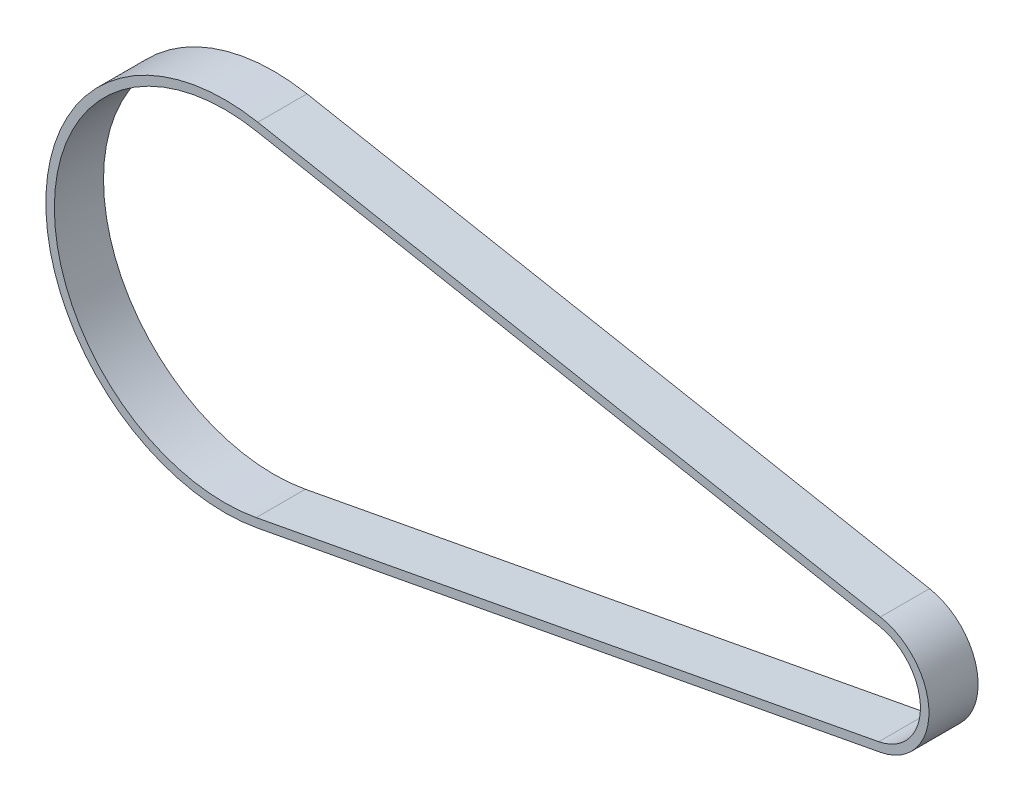
ISO-10303-21;
HEADER;
FILE_DESCRIPTION(('STEP AP214'),'2;1');
FILE_NAME('part.step','',(''),(''),'','','');
FILE_SCHEMA(('AUTOMOTIVE_DESIGN { 1 0 10303 214 1 1 1 1 }'));
ENDSEC;
DATA;
#1=APPLICATION_CONTEXT('core data for automotive mechanical design processes');
#2=APPLICATION_PROTOCOL_DEFINITION('international standard','automotive_design',2000,#1);
#3=PRODUCT_CONTEXT('',#1,'mechanical');
#4=PRODUCT('Part','Part','',(#3));
#5=PRODUCT_RELATED_PRODUCT_CATEGORY('part','',(#4));
#6=PRODUCT_DEFINITION_FORMATION('','',#4);
#7=PRODUCT_DEFINITION_CONTEXT('part definition',#1,'design');
#8=PRODUCT_DEFINITION('design','',#6,#7);
#9=PRODUCT_DEFINITION_SHAPE('','',#8);
#10=(LENGTH_UNIT() NAMED_UNIT(*) SI_UNIT(.MILLI.,.METRE.));
#11=(NAMED_UNIT(*) PLANE_ANGLE_UNIT() SI_UNIT($,.RADIAN.));
#12=(NAMED_UNIT(*) SI_UNIT($,.STERADIAN.) SOLID_ANGLE_UNIT());
#13=UNCERTAINTY_MEASURE_WITH_UNIT(LENGTH_MEASURE(1.E-05),#10,'distance_accuracy_value','');
#14=(GEOMETRIC_REPRESENTATION_CONTEXT(3) GLOBAL_UNCERTAINTY_ASSIGNED_CONTEXT((#13)) GLOBAL_UNIT_ASSIGNED_CONTEXT((#10,
#11,#12)) REPRESENTATION_CONTEXT('',''));
#15=CARTESIAN_POINT('',(0.,0.,0.));
#16=DIRECTION('',(0.,0.,1.));
#17=DIRECTION('',(1.,0.,0.));
#18=AXIS2_PLACEMENT_3D('',#15,#16,#17);
#19=CARTESIAN_POINT('',(0.,0.,6.4));
#20=DIRECTION('',(0.,0.,-1.));
#21=DIRECTION('',(-1.,0.,0.));
#22=AXIS2_PLACEMENT_3D('',#19,#20,#21);
#23=CYLINDRICAL_SURFACE('',#22,23.285);
#24=CARTESIAN_POINT('',(0.,0.,0.));
#25=DIRECTION('',(0.,0.,1.));
#26=DIRECTION('',(1.,0.,0.));
#27=AXIS2_PLACEMENT_3D('',#24,#25,#26);
#28=CIRCLE('',#27,23.285);
#29=CARTESIAN_POINT('',(4.3081828745084,22.8829802543242,0.));
#30=VERTEX_POINT('',#29);
#31=CARTESIAN_POINT('',(4.3081828745084,-22.8829802543242,0.));
#32=VERTEX_POINT('',#31);
#33=EDGE_CURVE('E151',#30,#32,#28,.T.);
#34=ORIENTED_EDGE('',*,*,#33,.T.);
#35=DIRECTION('',(0.,0.,-1.));
#36=VECTOR('',#35,1.);
#37=CARTESIAN_POINT('',(4.3081828745084,-22.8829802543242,6.4));
#38=LINE('',#37,#36);
#39=CARTESIAN_POINT('',(4.3081828745084,-22.8829802543242,6.4));
#40=VERTEX_POINT('',#39);
#41=EDGE_CURVE('E11',#40,#32,#38,.T.);
#42=ORIENTED_EDGE('',*,*,#41,.F.);
#43=CARTESIAN_POINT('',(0.,0.,6.4));
#44=DIRECTION('',(0.,0.,1.));
#45=DIRECTION('',(1.,0.,0.));
#46=AXIS2_PLACEMENT_3D('',#43,#44,#45);
#47=CIRCLE('',#46,23.285);
#48=CARTESIAN_POINT('',(4.3081828745084,22.8829802543242,6.4));
#49=VERTEX_POINT('',#48);
#50=EDGE_CURVE('E157',#49,#40,#47,.T.);
#51=ORIENTED_EDGE('',*,*,#50,.F.);
#52=DIRECTION('',(0.,0.,-1.));
#53=VECTOR('',#52,1.);
#54=CARTESIAN_POINT('',(4.3081828745084,22.8829802543242,6.4));
#55=LINE('',#54,#53);
#56=EDGE_CURVE('E171',#49,#30,#55,.T.);
#57=ORIENTED_EDGE('',*,*,#56,.T.);
#58=EDGE_LOOP('',(#34,#42,#51,#57));
#59=FACE_BOUND('',#58,.T.);
#60=ADVANCED_FACE('F43',(#59),#23,.T.);
#61=CARTESIAN_POINT('',(4.3081828745084,-22.8829802543242,6.4));
#62=DIRECTION('',(-0.185019663925635,0.982734818738425,0.));
#63=DIRECTION('',(-0.982734818738425,-0.185019663925635,0.));
#64=AXIS2_PLACEMENT_3D('',#61,#62,#63);
#65=PLANE('',#64);
#66=DIRECTION('',(0.982734818738425,0.185019663925635,0.));
#67=VECTOR('',#66,1.);
#68=CARTESIAN_POINT('',(4.3081828745084,-22.8829802543242,0.));
#69=LINE('',#68,#67);
#70=CARTESIAN_POINT('',(85.3457525920629,-7.62602219341018,0.));
#71=VERTEX_POINT('',#70);
#72=EDGE_CURVE('E175',#32,#71,#69,.T.);
#73=ORIENTED_EDGE('',*,*,#72,.T.);
#74=DIRECTION('',(0.,0.,-1.));
#75=VECTOR('',#74,1.);
#76=CARTESIAN_POINT('',(85.3457525920629,-7.62602219341018,6.4));
#77=LINE('',#76,#75);
#78=CARTESIAN_POINT('',(85.3457525920629,-7.62602219341018,6.4));
#79=VERTEX_POINT('',#78);
#80=EDGE_CURVE('E51',#79,#71,#77,.T.);
#81=ORIENTED_EDGE('',*,*,#80,.F.);
#82=DIRECTION('',(0.982734818738425,0.185019663925635,0.));
#83=VECTOR('',#82,1.);
#84=CARTESIAN_POINT('',(4.3081828745084,-22.8829802543242,6.4));
#85=LINE('',#84,#83);
#86=EDGE_CURVE('E161',#40,#79,#85,.T.);
#87=ORIENTED_EDGE('',*,*,#86,.F.);
#88=ORIENTED_EDGE('',*,*,#41,.T.);
#89=EDGE_LOOP('',(#73,#81,#87,#88));
#90=FACE_BOUND('',#89,.T.);
#91=ADVANCED_FACE('F209',(#90),#65,.F.);
#92=CARTESIAN_POINT('',(83.91,0.,6.4));
#93=DIRECTION('',(0.,0.,-1.));
#94=DIRECTION('',(-1.,0.,0.));
#95=AXIS2_PLACEMENT_3D('',#92,#93,#94);
#96=CYLINDRICAL_SURFACE('',#95,7.76);
#97=CARTESIAN_POINT('',(83.91,0.,0.));
#98=DIRECTION('',(0.,0.,1.));
#99=DIRECTION('',(1.,0.,0.));
#100=AXIS2_PLACEMENT_3D('',#97,#98,#99);
#101=CIRCLE('',#100,7.76);
#102=CARTESIAN_POINT('',(85.3457525920629,7.62602219341018,0.));
#103=VERTEX_POINT('',#102);
#104=EDGE_CURVE('E178',#71,#103,#101,.T.);
#105=ORIENTED_EDGE('',*,*,#104,.T.);
#106=DIRECTION('',(0.,0.,-1.));
#107=VECTOR('',#106,1.);
#108=CARTESIAN_POINT('',(85.3457525920629,7.62602219341018,6.4));
#109=LINE('',#108,#107);
#110=CARTESIAN_POINT('',(85.3457525920629,7.62602219341018,6.4));
#111=VERTEX_POINT('',#110);
#112=EDGE_CURVE('E186',#111,#103,#109,.T.);
#113=ORIENTED_EDGE('',*,*,#112,.F.);
#114=CARTESIAN_POINT('',(83.91,0.,6.4));
#115=DIRECTION('',(0.,0.,1.));
#116=DIRECTION('',(1.,0.,0.));
#117=AXIS2_PLACEMENT_3D('',#114,#115,#116);
#118=CIRCLE('',#117,7.76);
#119=EDGE_CURVE('E165',#79,#111,#118,.T.);
#120=ORIENTED_EDGE('',*,*,#119,.F.);
#121=ORIENTED_EDGE('',*,*,#80,.T.);
#122=EDGE_LOOP('',(#105,#113,#120,#121));
#123=FACE_BOUND('',#122,.T.);
#124=ADVANCED_FACE('F195',(#123),#96,.T.);
#125=CARTESIAN_POINT('',(4.3081828745084,22.8829802543242,6.4));
#126=DIRECTION('',(-0.185019663925635,-0.982734818738425,0.));
#127=DIRECTION('',(0.982734818738425,-0.185019663925635,0.));
#128=AXIS2_PLACEMENT_3D('',#125,#126,#127);
#129=PLANE('',#128);
#130=DIRECTION('',(-0.982734818738425,0.185019663925635,0.));
#131=VECTOR('',#130,1.);
#132=CARTESIAN_POINT('',(4.3081828745084,22.8829802543242,0.));
#133=LINE('',#132,#131);
#134=EDGE_CURVE('E162',#103,#30,#133,.T.);
#135=ORIENTED_EDGE('',*,*,#134,.T.);
#136=ORIENTED_EDGE('',*,*,#56,.F.);
#137=DIRECTION('',(-0.982734818738425,0.185019663925635,0.));
#138=VECTOR('',#137,1.);
#139=CARTESIAN_POINT('',(4.3081828745084,22.8829802543242,6.4));
#140=LINE('',#139,#138);
#141=EDGE_CURVE('E168',#111,#49,#140,.T.);
#142=ORIENTED_EDGE('',*,*,#141,.F.);
#143=ORIENTED_EDGE('',*,*,#112,.T.);
#144=EDGE_LOOP('',(#135,#136,#142,#143));
#145=FACE_BOUND('',#144,.T.);
#146=ADVANCED_FACE('F202',(#145),#129,.F.);
#147=CARTESIAN_POINT('',(0.,0.,6.4));
#148=DIRECTION('',(0.,0.,1.));
#149=DIRECTION('',(1.,0.,0.));
#150=AXIS2_PLACEMENT_3D('',#147,#148,#149);
#151=PLANE('',#150);
#152=CARTESIAN_POINT('',(83.91,0.,6.4));
#153=DIRECTION('',(0.,0.,1.));
#154=DIRECTION('',(1.,0.,0.));
#155=AXIS2_PLACEMENT_3D('',#152,#153,#154);
#156=CIRCLE('',#155,6.65);
#157=CARTESIAN_POINT('',(85.1403807651055,-6.53518654461053,6.4));
#158=VERTEX_POINT('',#157);
#159=CARTESIAN_POINT('',(85.1403807651054,6.53518654461054,6.4));
#160=VERTEX_POINT('',#159);
#161=EDGE_CURVE('E58',#158,#160,#156,.T.);
#162=ORIENTED_EDGE('',*,*,#161,.F.);
#163=DIRECTION('',(0.982734818738425,0.185019663925635,0.));
#164=VECTOR('',#163,1.);
#165=CARTESIAN_POINT('',(4.10281104755095,-21.7921446055246,6.4));
#166=LINE('',#165,#164);
#167=CARTESIAN_POINT('',(4.10281104755094,-21.7921446055246,6.4));
#168=VERTEX_POINT('',#167);
#169=EDGE_CURVE('E129',#168,#158,#166,.T.);
#170=ORIENTED_EDGE('',*,*,#169,.F.);
#171=CARTESIAN_POINT('',(0.,0.,6.4));
#172=DIRECTION('',(0.,0.,1.));
#173=DIRECTION('',(1.,0.,0.));
#174=AXIS2_PLACEMENT_3D('',#171,#172,#173);
#175=CIRCLE('',#174,22.175);
#176=CARTESIAN_POINT('',(4.10281104755095,21.7921446055246,6.4));
#177=VERTEX_POINT('',#176);
#178=EDGE_CURVE('E133',#177,#168,#175,.T.);
#179=ORIENTED_EDGE('',*,*,#178,.F.);
#180=DIRECTION('',(-0.982734818738425,0.185019663925635,0.));
#181=VECTOR('',#180,1.);
#182=CARTESIAN_POINT('',(4.10281104755095,21.7921446055246,6.4));
#183=LINE('',#182,#181);
#184=EDGE_CURVE('E142',#160,#177,#183,.T.);
#185=ORIENTED_EDGE('',*,*,#184,.F.);
#186=EDGE_LOOP('',(#162,#170,#179,#185));
#187=FACE_BOUND('',#186,.T.);
#188=ORIENTED_EDGE('',*,*,#50,.T.);
#189=ORIENTED_EDGE('',*,*,#86,.T.);
#190=ORIENTED_EDGE('',*,*,#119,.T.);
#191=ORIENTED_EDGE('',*,*,#141,.T.);
#192=EDGE_LOOP('',(#188,#189,#190,#191));
#193=FACE_BOUND('',#192,.T.);
#194=ADVANCED_FACE('F208',(#187,#193),#151,.T.);
#195=CARTESIAN_POINT('',(0.,0.,0.));
#196=DIRECTION('',(0.,0.,1.));
#197=DIRECTION('',(1.,0.,0.));
#198=AXIS2_PLACEMENT_3D('',#195,#196,#197);
#199=PLANE('',#198);
#200=DIRECTION('',(0.982734818738425,0.185019663925635,0.));
#201=VECTOR('',#200,1.);
#202=CARTESIAN_POINT('',(4.10281104755095,-21.7921446055246,0.));
#203=LINE('',#202,#201);
#204=CARTESIAN_POINT('',(4.10281104755094,-21.7921446055246,0.));
#205=VERTEX_POINT('',#204);
#206=CARTESIAN_POINT('',(85.1403807651055,-6.53518654461053,0.));
#207=VERTEX_POINT('',#206);
#208=EDGE_CURVE('E117',#205,#207,#203,.T.);
#209=ORIENTED_EDGE('',*,*,#208,.T.);
#210=CARTESIAN_POINT('',(83.91,0.,0.));
#211=DIRECTION('',(0.,0.,1.));
#212=DIRECTION('',(1.,0.,0.));
#213=AXIS2_PLACEMENT_3D('',#210,#211,#212);
#214=CIRCLE('',#213,6.65);
#215=CARTESIAN_POINT('',(85.1403807651055,6.53518654461053,0.));
#216=VERTEX_POINT('',#215);
#217=EDGE_CURVE('E110',#207,#216,#214,.T.);
#218=ORIENTED_EDGE('',*,*,#217,.T.);
#219=DIRECTION('',(-0.982734818738425,0.185019663925635,0.));
#220=VECTOR('',#219,1.);
#221=CARTESIAN_POINT('',(4.10281104755095,21.7921446055246,0.));
#222=LINE('',#221,#220);
#223=CARTESIAN_POINT('',(4.10281104755095,21.7921446055246,0.));
#224=VERTEX_POINT('',#223);
#225=EDGE_CURVE('E120',#216,#224,#222,.T.);
#226=ORIENTED_EDGE('',*,*,#225,.T.);
#227=CARTESIAN_POINT('',(0.,0.,0.));
#228=DIRECTION('',(0.,0.,1.));
#229=DIRECTION('',(1.,0.,0.));
#230=AXIS2_PLACEMENT_3D('',#227,#228,#229);
#231=CIRCLE('',#230,22.175);
#232=EDGE_CURVE('E66',#224,#205,#231,.T.);
#233=ORIENTED_EDGE('',*,*,#232,.T.);
#234=EDGE_LOOP('',(#209,#218,#226,#233));
#235=FACE_BOUND('',#234,.T.);
#236=ORIENTED_EDGE('',*,*,#33,.F.);
#237=ORIENTED_EDGE('',*,*,#134,.F.);
#238=ORIENTED_EDGE('',*,*,#104,.F.);
#239=ORIENTED_EDGE('',*,*,#72,.F.);
#240=EDGE_LOOP('',(#236,#237,#238,#239));
#241=FACE_BOUND('',#240,.T.);
#242=ADVANCED_FACE('F125',(#235,#241),#199,.F.);
#243=CARTESIAN_POINT('',(83.91,0.,0.));
#244=DIRECTION('',(0.,0.,1.));
#245=DIRECTION('',(1.,0.,0.));
#246=AXIS2_PLACEMENT_3D('',#243,#244,#245);
#247=CYLINDRICAL_SURFACE('',#246,6.65);
#248=ORIENTED_EDGE('',*,*,#161,.T.);
#249=DIRECTION('',(0.,0.,1.));
#250=VECTOR('',#249,1.);
#251=CARTESIAN_POINT('',(85.1403807651055,6.53518654461053,0.));
#252=LINE('',#251,#250);
#253=EDGE_CURVE('E106',#216,#160,#252,.T.);
#254=ORIENTED_EDGE('',*,*,#253,.F.);
#255=ORIENTED_EDGE('',*,*,#217,.F.);
#256=DIRECTION('',(0.,0.,1.));
#257=VECTOR('',#256,1.);
#258=CARTESIAN_POINT('',(85.1403807651055,-6.53518654461053,0.));
#259=LINE('',#258,#257);
#260=EDGE_CURVE('E148',#207,#158,#259,.T.);
#261=ORIENTED_EDGE('',*,*,#260,.T.);
#262=EDGE_LOOP('',(#248,#254,#255,#261));
#263=FACE_BOUND('',#262,.T.);
#264=ADVANCED_FACE('F108',(#263),#247,.F.);
#265=CARTESIAN_POINT('',(4.10281104755095,-21.7921446055246,0.));
#266=DIRECTION('',(0.185019663925635,-0.982734818738425,0.));
#267=DIRECTION('',(0.982734818738425,0.185019663925635,0.));
#268=AXIS2_PLACEMENT_3D('',#265,#266,#267);
#269=PLANE('',#268);
#270=ORIENTED_EDGE('',*,*,#169,.T.);
#271=ORIENTED_EDGE('',*,*,#260,.F.);
#272=ORIENTED_EDGE('',*,*,#208,.F.);
#273=DIRECTION('',(0.,0.,1.));
#274=VECTOR('',#273,1.);
#275=CARTESIAN_POINT('',(4.10281104755094,-21.7921446055246,0.));
#276=LINE('',#275,#274);
#277=EDGE_CURVE('E152',#205,#168,#276,.T.);
#278=ORIENTED_EDGE('',*,*,#277,.T.);
#279=EDGE_LOOP('',(#270,#271,#272,#278));
#280=FACE_BOUND('',#279,.T.);
#281=ADVANCED_FACE('F226',(#280),#269,.F.);
#282=CARTESIAN_POINT('',(0.,0.,0.));
#283=DIRECTION('',(0.,0.,1.));
#284=DIRECTION('',(1.,0.,0.));
#285=AXIS2_PLACEMENT_3D('',#282,#283,#284);
#286=CYLINDRICAL_SURFACE('',#285,22.175);
#287=ORIENTED_EDGE('',*,*,#178,.T.);
#288=ORIENTED_EDGE('',*,*,#277,.F.);
#289=ORIENTED_EDGE('',*,*,#232,.F.);
#290=DIRECTION('',(0.,0.,1.));
#291=VECTOR('',#290,1.);
#292=CARTESIAN_POINT('',(4.10281104755095,21.7921446055246,0.));
#293=LINE('',#292,#291);
#294=EDGE_CURVE('E116',#224,#177,#293,.T.);
#295=ORIENTED_EDGE('',*,*,#294,.T.);
#296=EDGE_LOOP('',(#287,#288,#289,#295));
#297=FACE_BOUND('',#296,.T.);
#298=ADVANCED_FACE('F229',(#297),#286,.F.);
#299=CARTESIAN_POINT('',(4.10281104755095,21.7921446055246,0.));
#300=DIRECTION('',(0.185019663925635,0.982734818738425,0.));
#301=DIRECTION('',(-0.982734818738425,0.185019663925635,0.));
#302=AXIS2_PLACEMENT_3D('',#299,#300,#301);
#303=PLANE('',#302);
#304=ORIENTED_EDGE('',*,*,#184,.T.);
#305=ORIENTED_EDGE('',*,*,#294,.F.);
#306=ORIENTED_EDGE('',*,*,#225,.F.);
#307=ORIENTED_EDGE('',*,*,#253,.T.);
#308=EDGE_LOOP('',(#304,#305,#306,#307));
#309=FACE_BOUND('',#308,.T.);
#310=ADVANCED_FACE('F121',(#309),#303,.F.);
#311=CLOSED_SHELL('',(#60,#91,#124,#146,#194,#242,#264,#281,#298,#310));
#312=MANIFOLD_SOLID_BREP('B2',#311);
#313=ADVANCED_BREP_SHAPE_REPRESENTATION('',(#18,#312),#14);
#314=SHAPE_DEFINITION_REPRESENTATION(#9,#313);
ENDSEC;
END-ISO-10303-21;
